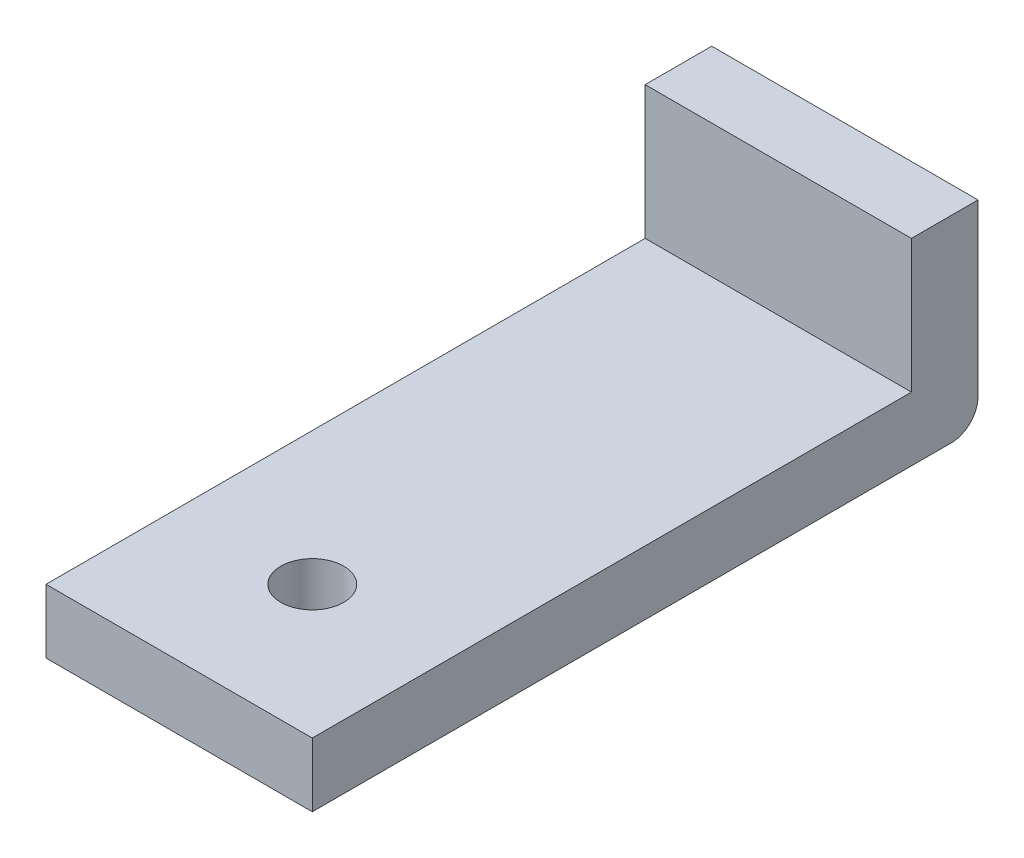
ISO-10303-21;
HEADER;
FILE_DESCRIPTION(('STEP AP214'),'2;1');
FILE_NAME('part.step','',(''),(''),'','','');
FILE_SCHEMA(('AUTOMOTIVE_DESIGN { 1 0 10303 214 1 1 1 1 }'));
ENDSEC;
DATA;
#1=APPLICATION_CONTEXT('core data for automotive mechanical design processes');
#2=APPLICATION_PROTOCOL_DEFINITION('international standard','automotive_design',2000,#1);
#3=PRODUCT_CONTEXT('',#1,'mechanical');
#4=PRODUCT('Part','Part','',(#3));
#5=PRODUCT_RELATED_PRODUCT_CATEGORY('part','',(#4));
#6=PRODUCT_DEFINITION_FORMATION('','',#4);
#7=PRODUCT_DEFINITION_CONTEXT('part definition',#1,'design');
#8=PRODUCT_DEFINITION('design','',#6,#7);
#9=PRODUCT_DEFINITION_SHAPE('','',#8);
#10=(LENGTH_UNIT() NAMED_UNIT(*) SI_UNIT(.MILLI.,.METRE.));
#11=(NAMED_UNIT(*) PLANE_ANGLE_UNIT() SI_UNIT($,.RADIAN.));
#12=(NAMED_UNIT(*) SI_UNIT($,.STERADIAN.) SOLID_ANGLE_UNIT());
#13=UNCERTAINTY_MEASURE_WITH_UNIT(LENGTH_MEASURE(1.E-05),#10,'distance_accuracy_value','');
#14=(GEOMETRIC_REPRESENTATION_CONTEXT(3) GLOBAL_UNCERTAINTY_ASSIGNED_CONTEXT((#13)) GLOBAL_UNIT_ASSIGNED_CONTEXT((#10,
#11,#12)) REPRESENTATION_CONTEXT('',''));
#15=CARTESIAN_POINT('',(0.,0.,0.));
#16=DIRECTION('',(0.,0.,1.));
#17=DIRECTION('',(1.,0.,0.));
#18=AXIS2_PLACEMENT_3D('',#15,#16,#17);
#19=CARTESIAN_POINT('',(6.35,3.048,15.875));
#20=DIRECTION('',(0.,0.,-1.));
#21=DIRECTION('',(-1.,0.,0.));
#22=AXIS2_PLACEMENT_3D('',#19,#20,#21);
#23=PLANE('',#22);
#24=DIRECTION('',(0.,-1.,0.));
#25=VECTOR('',#24,1.);
#26=CARTESIAN_POINT('',(-6.35,3.048,15.875));
#27=LINE('',#26,#25);
#28=CARTESIAN_POINT('',(-6.35,3.048,15.875));
#29=VERTEX_POINT('',#28);
#30=CARTESIAN_POINT('',(-6.35,0.,15.875));
#31=VERTEX_POINT('',#30);
#32=EDGE_CURVE('E118',#29,#31,#27,.T.);
#33=ORIENTED_EDGE('',*,*,#32,.T.);
#34=DIRECTION('',(-1.,0.,0.));
#35=VECTOR('',#34,1.);
#36=CARTESIAN_POINT('',(6.35,0.,15.875));
#37=LINE('',#36,#35);
#38=CARTESIAN_POINT('',(6.35,0.,15.875));
#39=VERTEX_POINT('',#38);
#40=EDGE_CURVE('E99',#39,#31,#37,.T.);
#41=ORIENTED_EDGE('',*,*,#40,.F.);
#42=DIRECTION('',(0.,-1.,0.));
#43=VECTOR('',#42,1.);
#44=CARTESIAN_POINT('',(6.35,3.048,15.875));
#45=LINE('',#44,#43);
#46=CARTESIAN_POINT('',(6.35,3.048,15.875));
#47=VERTEX_POINT('',#46);
#48=EDGE_CURVE('E105',#47,#39,#45,.T.);
#49=ORIENTED_EDGE('',*,*,#48,.F.);
#50=DIRECTION('',(-1.,0.,0.));
#51=VECTOR('',#50,1.);
#52=CARTESIAN_POINT('',(6.35,3.048,15.875));
#53=LINE('',#52,#51);
#54=EDGE_CURVE('E141',#47,#29,#53,.T.);
#55=ORIENTED_EDGE('',*,*,#54,.T.);
#56=EDGE_LOOP('',(#33,#41,#49,#55));
#57=FACE_BOUND('',#56,.T.);
#58=ADVANCED_FACE('F39',(#57),#23,.F.);
#59=CARTESIAN_POINT('',(6.35,0.,15.875));
#60=DIRECTION('',(0.,1.,0.));
#61=DIRECTION('',(0.,0.,1.));
#62=AXIS2_PLACEMENT_3D('',#59,#60,#61);
#63=PLANE('',#62);
#64=CARTESIAN_POINT('',(0.,0.,9.525));
#65=DIRECTION('',(0.,1.,0.));
#66=DIRECTION('',(0.,0.,1.));
#67=AXIS2_PLACEMENT_3D('',#64,#65,#66);
#68=CIRCLE('',#67,1.5);
#69=CARTESIAN_POINT('',(0.,0.,11.025));
#70=VERTEX_POINT('',#69);
#71=EDGE_CURVE('E160',#70,#70,#68,.T.);
#72=ORIENTED_EDGE('',*,*,#71,.T.);
#73=EDGE_LOOP('',(#72));
#74=FACE_BOUND('',#73,.T.);
#75=DIRECTION('',(0.,0.,-1.));
#76=VECTOR('',#75,1.);
#77=CARTESIAN_POINT('',(-6.35,0.,15.875));
#78=LINE('',#77,#76);
#79=CARTESIAN_POINT('',(-6.35,0.,-14.605));
#80=VERTEX_POINT('',#79);
#81=EDGE_CURVE('E155',#31,#80,#78,.T.);
#82=ORIENTED_EDGE('',*,*,#81,.T.);
#83=DIRECTION('',(-1.,0.,0.));
#84=VECTOR('',#83,1.);
#85=CARTESIAN_POINT('',(6.35,0.,-14.605));
#86=LINE('',#85,#84);
#87=CARTESIAN_POINT('',(6.35,0.,-14.605));
#88=VERTEX_POINT('',#87);
#89=EDGE_CURVE('E48',#80,#88,#86,.F.);
#90=ORIENTED_EDGE('',*,*,#89,.T.);
#91=DIRECTION('',(0.,0.,-1.));
#92=VECTOR('',#91,1.);
#93=CARTESIAN_POINT('',(6.35,0.,15.875));
#94=LINE('',#93,#92);
#95=EDGE_CURVE('E95',#39,#88,#94,.T.);
#96=ORIENTED_EDGE('',*,*,#95,.F.);
#97=ORIENTED_EDGE('',*,*,#40,.T.);
#98=EDGE_LOOP('',(#82,#90,#96,#97));
#99=FACE_BOUND('',#98,.T.);
#100=ADVANCED_FACE('F97',(#74,#99),#63,.F.);
#101=CARTESIAN_POINT('',(6.35,0.,-15.875));
#102=DIRECTION('',(0.,0.,1.));
#103=DIRECTION('',(1.,0.,0.));
#104=AXIS2_PLACEMENT_3D('',#101,#102,#103);
#105=PLANE('',#104);
#106=DIRECTION('',(0.,1.,0.));
#107=VECTOR('',#106,1.);
#108=CARTESIAN_POINT('',(6.35,0.,-15.875));
#109=LINE('',#108,#107);
#110=CARTESIAN_POINT('',(6.35,1.27,-15.875));
#111=VERTEX_POINT('',#110);
#112=CARTESIAN_POINT('',(6.35,9.39800000000001,-15.875));
#113=VERTEX_POINT('',#112);
#114=EDGE_CURVE('E104',#111,#113,#109,.T.);
#115=ORIENTED_EDGE('',*,*,#114,.F.);
#116=DIRECTION('',(-1.,0.,0.));
#117=VECTOR('',#116,1.);
#118=CARTESIAN_POINT('',(6.35,1.27,-15.875));
#119=LINE('',#118,#117);
#120=CARTESIAN_POINT('',(-6.35,1.27,-15.875));
#121=VERTEX_POINT('',#120);
#122=EDGE_CURVE('E120',#111,#121,#119,.T.);
#123=ORIENTED_EDGE('',*,*,#122,.T.);
#124=DIRECTION('',(0.,1.,0.));
#125=VECTOR('',#124,1.);
#126=CARTESIAN_POINT('',(-6.35,0.,-15.875));
#127=LINE('',#126,#125);
#128=CARTESIAN_POINT('',(-6.35,9.39800000000001,-15.875));
#129=VERTEX_POINT('',#128);
#130=EDGE_CURVE('E152',#121,#129,#127,.T.);
#131=ORIENTED_EDGE('',*,*,#130,.T.);
#132=DIRECTION('',(-1.,0.,0.));
#133=VECTOR('',#132,1.);
#134=CARTESIAN_POINT('',(6.35,9.39800000000001,-15.875));
#135=LINE('',#134,#133);
#136=EDGE_CURVE('E121',#113,#129,#135,.T.);
#137=ORIENTED_EDGE('',*,*,#136,.F.);
#138=EDGE_LOOP('',(#115,#123,#131,#137));
#139=FACE_BOUND('',#138,.T.);
#140=ADVANCED_FACE('F200',(#139),#105,.F.);
#141=CARTESIAN_POINT('',(6.35,9.39800000000001,-15.875));
#142=DIRECTION('',(0.,-1.,0.));
#143=DIRECTION('',(0.,0.,-1.));
#144=AXIS2_PLACEMENT_3D('',#141,#142,#143);
#145=PLANE('',#144);
#146=DIRECTION('',(0.,0.,1.));
#147=VECTOR('',#146,1.);
#148=CARTESIAN_POINT('',(-6.35,9.39800000000001,-15.875));
#149=LINE('',#148,#147);
#150=CARTESIAN_POINT('',(-6.35,9.39800000000001,-12.7));
#151=VERTEX_POINT('',#150);
#152=EDGE_CURVE('E149',#129,#151,#149,.T.);
#153=ORIENTED_EDGE('',*,*,#152,.T.);
#154=DIRECTION('',(-1.,0.,0.));
#155=VECTOR('',#154,1.);
#156=CARTESIAN_POINT('',(6.35,9.39800000000001,-12.7));
#157=LINE('',#156,#155);
#158=CARTESIAN_POINT('',(6.35,9.39800000000001,-12.7));
#159=VERTEX_POINT('',#158);
#160=EDGE_CURVE('E128',#159,#151,#157,.T.);
#161=ORIENTED_EDGE('',*,*,#160,.F.);
#162=DIRECTION('',(0.,0.,1.));
#163=VECTOR('',#162,1.);
#164=CARTESIAN_POINT('',(6.35,9.39800000000001,-15.875));
#165=LINE('',#164,#163);
#166=EDGE_CURVE('E166',#113,#159,#165,.T.);
#167=ORIENTED_EDGE('',*,*,#166,.F.);
#168=ORIENTED_EDGE('',*,*,#136,.T.);
#169=EDGE_LOOP('',(#153,#161,#167,#168));
#170=FACE_BOUND('',#169,.T.);
#171=ADVANCED_FACE('F205',(#170),#145,.F.);
#172=CARTESIAN_POINT('',(6.35,9.39800000000001,-12.7));
#173=DIRECTION('',(0.,0.,-1.));
#174=DIRECTION('',(0.,1.,0.));
#175=AXIS2_PLACEMENT_3D('',#172,#173,#174);
#176=PLANE('',#175);
#177=DIRECTION('',(0.,-1.,0.));
#178=VECTOR('',#177,1.);
#179=CARTESIAN_POINT('',(-6.35,9.39800000000001,-12.7));
#180=LINE('',#179,#178);
#181=CARTESIAN_POINT('',(-6.35,3.048,-12.7));
#182=VERTEX_POINT('',#181);
#183=EDGE_CURVE('E146',#151,#182,#180,.T.);
#184=ORIENTED_EDGE('',*,*,#183,.T.);
#185=DIRECTION('',(-1.,0.,0.));
#186=VECTOR('',#185,1.);
#187=CARTESIAN_POINT('',(6.35,3.048,-12.7));
#188=LINE('',#187,#186);
#189=CARTESIAN_POINT('',(6.35,3.048,-12.7));
#190=VERTEX_POINT('',#189);
#191=EDGE_CURVE('E137',#190,#182,#188,.T.);
#192=ORIENTED_EDGE('',*,*,#191,.F.);
#193=DIRECTION('',(0.,-1.,0.));
#194=VECTOR('',#193,1.);
#195=CARTESIAN_POINT('',(6.35,9.39800000000001,-12.7));
#196=LINE('',#195,#194);
#197=EDGE_CURVE('E163',#159,#190,#196,.T.);
#198=ORIENTED_EDGE('',*,*,#197,.F.);
#199=ORIENTED_EDGE('',*,*,#160,.T.);
#200=EDGE_LOOP('',(#184,#192,#198,#199));
#201=FACE_BOUND('',#200,.T.);
#202=ADVANCED_FACE('F190',(#201),#176,.F.);
#203=CARTESIAN_POINT('',(6.35,3.048,-12.7));
#204=DIRECTION('',(0.,-1.,0.));
#205=DIRECTION('',(0.,0.,-1.));
#206=AXIS2_PLACEMENT_3D('',#203,#204,#205);
#207=PLANE('',#206);
#208=CARTESIAN_POINT('',(0.,3.048,9.525));
#209=DIRECTION('',(0.,1.,0.));
#210=DIRECTION('',(0.,0.,1.));
#211=AXIS2_PLACEMENT_3D('',#208,#209,#210);
#212=CIRCLE('',#211,1.5);
#213=CARTESIAN_POINT('',(0.,3.048,11.025));
#214=VERTEX_POINT('',#213);
#215=EDGE_CURVE('E171',#214,#214,#212,.T.);
#216=ORIENTED_EDGE('',*,*,#215,.F.);
#217=EDGE_LOOP('',(#216));
#218=FACE_BOUND('',#217,.T.);
#219=DIRECTION('',(0.,0.,1.));
#220=VECTOR('',#219,1.);
#221=CARTESIAN_POINT('',(-6.35,3.048,-12.7));
#222=LINE('',#221,#220);
#223=EDGE_CURVE('E115',#182,#29,#222,.T.);
#224=ORIENTED_EDGE('',*,*,#223,.T.);
#225=ORIENTED_EDGE('',*,*,#54,.F.);
#226=DIRECTION('',(0.,0.,1.));
#227=VECTOR('',#226,1.);
#228=CARTESIAN_POINT('',(6.35,3.048,-12.7));
#229=LINE('',#228,#227);
#230=EDGE_CURVE('E110',#190,#47,#229,.T.);
#231=ORIENTED_EDGE('',*,*,#230,.F.);
#232=ORIENTED_EDGE('',*,*,#191,.T.);
#233=EDGE_LOOP('',(#224,#225,#231,#232));
#234=FACE_BOUND('',#233,.T.);
#235=ADVANCED_FACE('F187',(#218,#234),#207,.F.);
#236=CARTESIAN_POINT('',(6.35,0.,0.));
#237=DIRECTION('',(1.,0.,0.));
#238=DIRECTION('',(0.,0.,-1.));
#239=AXIS2_PLACEMENT_3D('',#236,#237,#238);
#240=PLANE('',#239);
#241=ORIENTED_EDGE('',*,*,#95,.T.);
#242=CARTESIAN_POINT('',(6.35,1.27,-14.605));
#243=DIRECTION('',(1.,0.,0.));
#244=DIRECTION('',(0.,0.,-1.));
#245=AXIS2_PLACEMENT_3D('',#242,#243,#244);
#246=CIRCLE('',#245,1.27);
#247=EDGE_CURVE('E11',#88,#111,#246,.T.);
#248=ORIENTED_EDGE('',*,*,#247,.T.);
#249=ORIENTED_EDGE('',*,*,#114,.T.);
#250=ORIENTED_EDGE('',*,*,#166,.T.);
#251=ORIENTED_EDGE('',*,*,#197,.T.);
#252=ORIENTED_EDGE('',*,*,#230,.T.);
#253=ORIENTED_EDGE('',*,*,#48,.T.);
#254=EDGE_LOOP('',(#241,#248,#249,#250,#251,#252,#253));
#255=FACE_BOUND('',#254,.T.);
#256=ADVANCED_FACE('F108',(#255),#240,.T.);
#257=CARTESIAN_POINT('',(-6.35,0.,0.));
#258=DIRECTION('',(1.,0.,0.));
#259=DIRECTION('',(0.,0.,-1.));
#260=AXIS2_PLACEMENT_3D('',#257,#258,#259);
#261=PLANE('',#260);
#262=ORIENTED_EDGE('',*,*,#130,.F.);
#263=CARTESIAN_POINT('',(-6.35,1.27,-14.605));
#264=DIRECTION('',(1.,0.,0.));
#265=DIRECTION('',(0.,0.,-1.));
#266=AXIS2_PLACEMENT_3D('',#263,#264,#265);
#267=CIRCLE('',#266,1.27);
#268=EDGE_CURVE('E62',#121,#80,#267,.F.);
#269=ORIENTED_EDGE('',*,*,#268,.T.);
#270=ORIENTED_EDGE('',*,*,#81,.F.);
#271=ORIENTED_EDGE('',*,*,#32,.F.);
#272=ORIENTED_EDGE('',*,*,#223,.F.);
#273=ORIENTED_EDGE('',*,*,#183,.F.);
#274=ORIENTED_EDGE('',*,*,#152,.F.);
#275=EDGE_LOOP('',(#262,#269,#270,#271,#272,#273,#274));
#276=FACE_BOUND('',#275,.T.);
#277=ADVANCED_FACE('F183',(#276),#261,.F.);
#278=CARTESIAN_POINT('',(0.,0.,9.525));
#279=DIRECTION('',(0.,1.,0.));
#280=DIRECTION('',(0.,0.,1.));
#281=AXIS2_PLACEMENT_3D('',#278,#279,#280);
#282=CYLINDRICAL_SURFACE('',#281,1.5);
#283=ORIENTED_EDGE('',*,*,#71,.F.);
#284=EDGE_LOOP('',(#283));
#285=FACE_BOUND('',#284,.T.);
#286=ORIENTED_EDGE('',*,*,#215,.T.);
#287=EDGE_LOOP('',(#286));
#288=FACE_BOUND('',#287,.T.);
#289=ADVANCED_FACE('F180',(#285,#288),#282,.F.);
#290=CARTESIAN_POINT('',(6.35,1.27,-14.605));
#291=DIRECTION('',(-1.,0.,0.));
#292=DIRECTION('',(0.,0.,1.));
#293=AXIS2_PLACEMENT_3D('',#290,#291,#292);
#294=CYLINDRICAL_SURFACE('',#293,1.27);
#295=ORIENTED_EDGE('',*,*,#247,.F.);
#296=ORIENTED_EDGE('',*,*,#89,.F.);
#297=ORIENTED_EDGE('',*,*,#268,.F.);
#298=ORIENTED_EDGE('',*,*,#122,.F.);
#299=EDGE_LOOP('',(#295,#296,#297,#298));
#300=FACE_BOUND('',#299,.T.);
#301=ADVANCED_FACE('F41',(#300),#294,.T.);
#302=CLOSED_SHELL('',(#58,#100,#140,#171,#202,#235,#256,#277,#289,#301));
#303=MANIFOLD_SOLID_BREP('B2',#302);
#304=ADVANCED_BREP_SHAPE_REPRESENTATION('',(#18,#303),#14);
#305=SHAPE_DEFINITION_REPRESENTATION(#9,#304);
ENDSEC;
END-ISO-10303-21;
